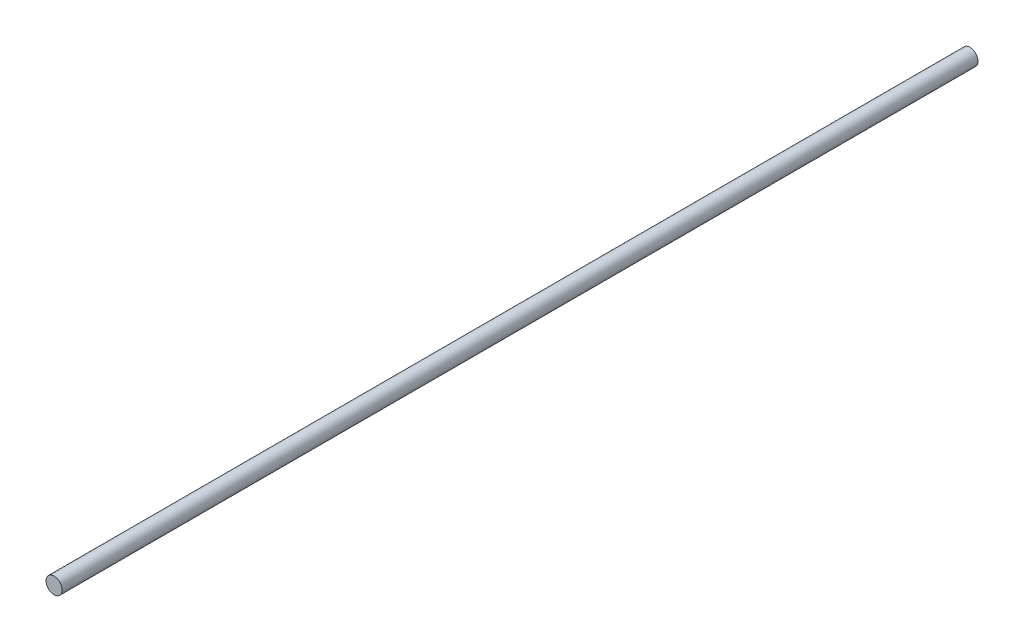
ISO-10303-21;
HEADER;
FILE_DESCRIPTION(('STEP AP214'),'2;1');
FILE_NAME('part.step','',(''),(''),'','','');
FILE_SCHEMA(('AUTOMOTIVE_DESIGN { 1 0 10303 214 1 1 1 1 }'));
ENDSEC;
DATA;
#1=APPLICATION_CONTEXT('core data for automotive mechanical design processes');
#2=APPLICATION_PROTOCOL_DEFINITION('international standard','automotive_design',2000,#1);
#3=PRODUCT_CONTEXT('',#1,'mechanical');
#4=PRODUCT('Part','Part','',(#3));
#5=PRODUCT_RELATED_PRODUCT_CATEGORY('part','',(#4));
#6=PRODUCT_DEFINITION_FORMATION('','',#4);
#7=PRODUCT_DEFINITION_CONTEXT('part definition',#1,'design');
#8=PRODUCT_DEFINITION('design','',#6,#7);
#9=PRODUCT_DEFINITION_SHAPE('','',#8);
#10=(LENGTH_UNIT() NAMED_UNIT(*) SI_UNIT(.MILLI.,.METRE.));
#11=(NAMED_UNIT(*) PLANE_ANGLE_UNIT() SI_UNIT($,.RADIAN.));
#12=(NAMED_UNIT(*) SI_UNIT($,.STERADIAN.) SOLID_ANGLE_UNIT());
#13=UNCERTAINTY_MEASURE_WITH_UNIT(LENGTH_MEASURE(1.E-05),#10,'distance_accuracy_value','');
#14=(GEOMETRIC_REPRESENTATION_CONTEXT(3) GLOBAL_UNCERTAINTY_ASSIGNED_CONTEXT((#13)) GLOBAL_UNIT_ASSIGNED_CONTEXT((#10,
#11,#12)) REPRESENTATION_CONTEXT('',''));
#15=CARTESIAN_POINT('',(0.,0.,0.));
#16=DIRECTION('',(0.,0.,1.));
#17=DIRECTION('',(1.,0.,0.));
#18=AXIS2_PLACEMENT_3D('',#15,#16,#17);
#19=CARTESIAN_POINT('',(0.,0.,180.));
#20=DIRECTION('',(0.,0.,-1.));
#21=DIRECTION('',(-1.,0.,0.));
#22=AXIS2_PLACEMENT_3D('',#19,#20,#21);
#23=CYLINDRICAL_SURFACE('',#22,3.175);
#24=CARTESIAN_POINT('',(0.,0.,180.));
#25=DIRECTION('',(0.,0.,1.));
#26=DIRECTION('',(1.,0.,0.));
#27=AXIS2_PLACEMENT_3D('',#24,#25,#26);
#28=CIRCLE('',#27,3.175);
#29=CARTESIAN_POINT('',(-3.175,0.,180.));
#30=VERTEX_POINT('',#29);
#31=EDGE_CURVE('E10',#30,#30,#28,.T.);
#32=CARTESIAN_POINT('',(0.,0.,-180.));
#33=DIRECTION('',(0.,0.,1.));
#34=DIRECTION('',(1.,0.,0.));
#35=AXIS2_PLACEMENT_3D('',#32,#33,#34);
#36=CIRCLE('',#35,3.175);
#37=CARTESIAN_POINT('',(-3.175,0.,-180.));
#38=VERTEX_POINT('',#37);
#39=EDGE_CURVE('E34',#38,#38,#36,.T.);
#40=CARTESIAN_POINT('',(-3.175,0.,180.));
#41=CARTESIAN_POINT('',(-3.175,0.,176.25));
#42=CARTESIAN_POINT('',(-3.175,0.,172.5));
#43=CARTESIAN_POINT('',(-3.175,0.,165.));
#44=CARTESIAN_POINT('',(-3.175,0.,161.25));
#45=CARTESIAN_POINT('',(-3.175,0.,153.75));
#46=CARTESIAN_POINT('',(-3.175,0.,150.));
#47=CARTESIAN_POINT('',(-3.175,0.,142.5));
#48=CARTESIAN_POINT('',(-3.175,0.,138.75));
#49=CARTESIAN_POINT('',(-3.175,0.,131.25));
#50=CARTESIAN_POINT('',(-3.175,0.,127.5));
#51=CARTESIAN_POINT('',(-3.175,0.,120.));
#52=CARTESIAN_POINT('',(-3.175,0.,116.25));
#53=CARTESIAN_POINT('',(-3.175,0.,108.75));
#54=CARTESIAN_POINT('',(-3.175,0.,105.));
#55=CARTESIAN_POINT('',(-3.175,0.,97.5));
#56=CARTESIAN_POINT('',(-3.175,0.,93.75));
#57=CARTESIAN_POINT('',(-3.175,0.,86.25));
#58=CARTESIAN_POINT('',(-3.175,0.,82.5));
#59=CARTESIAN_POINT('',(-3.175,0.,75.));
#60=CARTESIAN_POINT('',(-3.175,0.,71.25));
#61=CARTESIAN_POINT('',(-3.175,0.,63.75));
#62=CARTESIAN_POINT('',(-3.175,0.,60.));
#63=CARTESIAN_POINT('',(-3.175,0.,52.5));
#64=CARTESIAN_POINT('',(-3.175,0.,48.75));
#65=CARTESIAN_POINT('',(-3.175,0.,41.25));
#66=CARTESIAN_POINT('',(-3.175,0.,37.5));
#67=CARTESIAN_POINT('',(-3.175,0.,30.));
#68=CARTESIAN_POINT('',(-3.175,0.,26.25));
#69=CARTESIAN_POINT('',(-3.175,0.,18.75));
#70=CARTESIAN_POINT('',(-3.175,0.,15.));
#71=CARTESIAN_POINT('',(-3.175,0.,7.49999999999998));
#72=CARTESIAN_POINT('',(-3.175,0.,3.74999999999998));
#73=CARTESIAN_POINT('',(-3.175,0.,-3.75000000000003));
#74=CARTESIAN_POINT('',(-3.175,0.,-7.50000000000003));
#75=CARTESIAN_POINT('',(-3.175,0.,-15.));
#76=CARTESIAN_POINT('',(-3.175,0.,-18.75));
#77=CARTESIAN_POINT('',(-3.175,0.,-26.25));
#78=CARTESIAN_POINT('',(-3.175,0.,-30.));
#79=CARTESIAN_POINT('',(-3.175,0.,-37.5));
#80=CARTESIAN_POINT('',(-3.175,0.,-41.25));
#81=CARTESIAN_POINT('',(-3.175,0.,-48.75));
#82=CARTESIAN_POINT('',(-3.175,0.,-52.5));
#83=CARTESIAN_POINT('',(-3.175,0.,-60.));
#84=CARTESIAN_POINT('',(-3.175,0.,-63.75));
#85=CARTESIAN_POINT('',(-3.175,0.,-71.25));
#86=CARTESIAN_POINT('',(-3.175,0.,-75.));
#87=CARTESIAN_POINT('',(-3.175,0.,-82.5));
#88=CARTESIAN_POINT('',(-3.175,0.,-86.25));
#89=CARTESIAN_POINT('',(-3.175,0.,-93.75));
#90=CARTESIAN_POINT('',(-3.175,0.,-97.5));
#91=CARTESIAN_POINT('',(-3.175,0.,-105.));
#92=CARTESIAN_POINT('',(-3.175,0.,-108.75));
#93=CARTESIAN_POINT('',(-3.175,0.,-116.25));
#94=CARTESIAN_POINT('',(-3.175,0.,-120.));
#95=CARTESIAN_POINT('',(-3.175,0.,-127.5));
#96=CARTESIAN_POINT('',(-3.175,0.,-131.25));
#97=CARTESIAN_POINT('',(-3.175,0.,-138.75));
#98=CARTESIAN_POINT('',(-3.175,0.,-142.5));
#99=CARTESIAN_POINT('',(-3.175,0.,-150.));
#100=CARTESIAN_POINT('',(-3.175,0.,-153.75));
#101=CARTESIAN_POINT('',(-3.175,0.,-161.25));
#102=CARTESIAN_POINT('',(-3.175,0.,-165.));
#103=CARTESIAN_POINT('',(-3.175,0.,-172.5));
#104=CARTESIAN_POINT('',(-3.175,0.,-176.25));
#105=CARTESIAN_POINT('',(-3.175,0.,-180.));
#106=B_SPLINE_CURVE_WITH_KNOTS('',3,(#40,#41,#42,#43,#44,#45,#46,#47,#48,#49,#50,#51,#52,#53,
#54,#55,#56,#57,#58,#59,#60,#61,#62,#63,#64,#65,#66,#67,#68,#69,#70,#71,#72,#73,#74,#75,#76,#77,
#78,#79,#80,#81,#82,#83,#84,#85,#86,#87,#88,#89,#90,#91,#92,#93,#94,#95,#96,#97,#98,#99,#100,
#101,#102,#103,#104,#105),.UNSPECIFIED.,.F.,.F.,(4,2,2,2,2,2,2,2,2,2,2,2,2,2,2,2,2,2,2,2,2,2,2,
2,2,2,2,2,2,2,2,2,4),(0.,11.25,22.5,33.75,45.,56.25,67.5,78.75,90.,101.25,112.5,123.75,135.,
146.25,157.5,168.75,180.,191.25,202.5,213.75,225.,236.25,247.5,258.75,270.,281.25,292.5,303.75,
315.,326.25,337.5,348.75,360.),.UNSPECIFIED.);
#107=EDGE_CURVE('BSEAM31',#30,#38,#106,.T.);
#108=ORIENTED_EDGE('',*,*,#31,.F.);
#109=ORIENTED_EDGE('',*,*,#39,.T.);
#110=ORIENTED_EDGE('',*,*,#107,.T.);
#111=ORIENTED_EDGE('',*,*,#107,.F.);
#112=EDGE_LOOP('',(#108,#110,#109,#111));
#113=FACE_BOUND('',#112,.T.);
#114=ADVANCED_FACE('F31',(#113),#23,.T.);
#115=CARTESIAN_POINT('',(0.,0.,180.));
#116=DIRECTION('',(0.,0.,1.));
#117=DIRECTION('',(1.,0.,0.));
#118=AXIS2_PLACEMENT_3D('',#115,#116,#117);
#119=PLANE('',#118);
#120=ORIENTED_EDGE('',*,*,#31,.T.);
#121=EDGE_LOOP('',(#120));
#122=FACE_BOUND('',#121,.T.);
#123=ADVANCED_FACE('F46',(#122),#119,.T.);
#124=CARTESIAN_POINT('',(0.,0.,-180.));
#125=DIRECTION('',(0.,0.,1.));
#126=DIRECTION('',(1.,0.,0.));
#127=AXIS2_PLACEMENT_3D('',#124,#125,#126);
#128=PLANE('',#127);
#129=ORIENTED_EDGE('',*,*,#39,.F.);
#130=EDGE_LOOP('',(#129));
#131=FACE_BOUND('',#130,.T.);
#132=ADVANCED_FACE('F44',(#131),#128,.F.);
#133=CLOSED_SHELL('',(#114,#123,#132));
#134=MANIFOLD_SOLID_BREP('B2',#133);
#135=ADVANCED_BREP_SHAPE_REPRESENTATION('',(#18,#134),#14);
#136=SHAPE_DEFINITION_REPRESENTATION(#9,#135);
ENDSEC;
END-ISO-10303-21;
